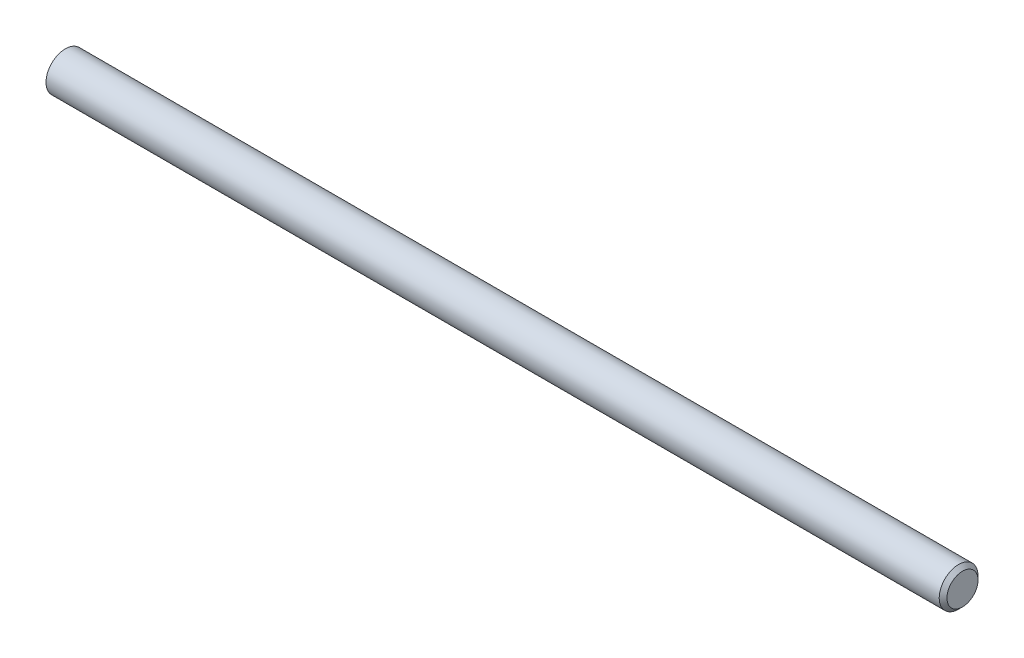
ISO-10303-21;
HEADER;
FILE_DESCRIPTION(('STEP AP214'),'2;1');
FILE_NAME('part.step','',(''),(''),'','','');
FILE_SCHEMA(('AUTOMOTIVE_DESIGN { 1 0 10303 214 1 1 1 1 }'));
ENDSEC;
DATA;
#1=APPLICATION_CONTEXT('core data for automotive mechanical design processes');
#2=APPLICATION_PROTOCOL_DEFINITION('international standard','automotive_design',2000,#1);
#3=PRODUCT_CONTEXT('',#1,'mechanical');
#4=PRODUCT('Part','Part','',(#3));
#5=PRODUCT_RELATED_PRODUCT_CATEGORY('part','',(#4));
#6=PRODUCT_DEFINITION_FORMATION('','',#4);
#7=PRODUCT_DEFINITION_CONTEXT('part definition',#1,'design');
#8=PRODUCT_DEFINITION('design','',#6,#7);
#9=PRODUCT_DEFINITION_SHAPE('','',#8);
#10=(LENGTH_UNIT() NAMED_UNIT(*) SI_UNIT(.MILLI.,.METRE.));
#11=(NAMED_UNIT(*) PLANE_ANGLE_UNIT() SI_UNIT($,.RADIAN.));
#12=(NAMED_UNIT(*) SI_UNIT($,.STERADIAN.) SOLID_ANGLE_UNIT());
#13=UNCERTAINTY_MEASURE_WITH_UNIT(LENGTH_MEASURE(1.E-05),#10,'distance_accuracy_value','');
#14=(GEOMETRIC_REPRESENTATION_CONTEXT(3) GLOBAL_UNCERTAINTY_ASSIGNED_CONTEXT((#13)) GLOBAL_UNIT_ASSIGNED_CONTEXT((#10,
#11,#12)) REPRESENTATION_CONTEXT('',''));
#15=CARTESIAN_POINT('',(0.,0.,0.));
#16=DIRECTION('',(0.,0.,1.));
#17=DIRECTION('',(1.,0.,0.));
#18=AXIS2_PLACEMENT_3D('',#15,#16,#17);
#19=CARTESIAN_POINT('',(0.,0.,-4.));
#20=DIRECTION('',(1.,0.,0.));
#21=DIRECTION('',(0.,0.,-1.));
#22=AXIS2_PLACEMENT_3D('',#19,#20,#21);
#23=PLANE('',#22);
#24=CARTESIAN_POINT('',(0.,0.,0.));
#25=DIRECTION('',(-1.,0.,0.));
#26=DIRECTION('',(0.,0.,1.));
#27=AXIS2_PLACEMENT_3D('',#24,#25,#26);
#28=CIRCLE('',#27,4.);
#29=CARTESIAN_POINT('',(0.,0.,4.));
#30=VERTEX_POINT('',#29);
#31=EDGE_CURVE('E45',#30,#30,#28,.T.);
#32=ORIENTED_EDGE('',*,*,#31,.T.);
#33=EDGE_LOOP('',(#32));
#34=FACE_BOUND('',#33,.T.);
#35=ADVANCED_FACE('F35',(#34),#23,.F.);
#36=CARTESIAN_POINT('',(185.,0.,0.));
#37=DIRECTION('',(-1.,0.,0.));
#38=DIRECTION('',(0.,0.,1.));
#39=AXIS2_PLACEMENT_3D('',#36,#37,#38);
#40=PLANE('',#39);
#41=CARTESIAN_POINT('',(185.,0.,0.));
#42=DIRECTION('',(-1.,0.,0.));
#43=DIRECTION('',(0.,0.,1.));
#44=AXIS2_PLACEMENT_3D('',#41,#42,#43);
#45=CIRCLE('',#44,3.2);
#46=CARTESIAN_POINT('',(185.,0.,3.2));
#47=VERTEX_POINT('',#46);
#48=EDGE_CURVE('E10',#47,#47,#45,.T.);
#49=ORIENTED_EDGE('',*,*,#48,.F.);
#50=EDGE_LOOP('',(#49));
#51=FACE_BOUND('',#50,.T.);
#52=ADVANCED_FACE('F60',(#51),#40,.F.);
#53=CARTESIAN_POINT('',(185.,0.,0.));
#54=DIRECTION('',(-1.,0.,0.));
#55=DIRECTION('',(0.,0.,1.));
#56=AXIS2_PLACEMENT_3D('',#53,#54,#55);
#57=CONICAL_SURFACE('',#56,3.2,0.785398163397465);
#58=CARTESIAN_POINT('',(184.2,0.,0.));
#59=DIRECTION('',(-1.,0.,0.));
#60=DIRECTION('',(0.,0.,1.));
#61=AXIS2_PLACEMENT_3D('',#58,#59,#60);
#62=CIRCLE('',#61,4.00000000000002);
#63=CARTESIAN_POINT('',(184.2,0.,4.00000000000002));
#64=VERTEX_POINT('',#63);
#65=EDGE_CURVE('E41',#64,#64,#62,.T.);
#66=ORIENTED_EDGE('',*,*,#65,.F.);
#67=EDGE_LOOP('',(#66));
#68=FACE_BOUND('',#67,.T.);
#69=ORIENTED_EDGE('',*,*,#48,.T.);
#70=EDGE_LOOP('',(#69));
#71=FACE_BOUND('',#70,.T.);
#72=ADVANCED_FACE('F55',(#68,#71),#57,.T.);
#73=CARTESIAN_POINT('',(0.,0.,0.));
#74=DIRECTION('',(-1.,0.,0.));
#75=DIRECTION('',(0.,0.,1.));
#76=AXIS2_PLACEMENT_3D('',#73,#74,#75);
#77=CYLINDRICAL_SURFACE('',#76,4.00000000000001);
#78=ORIENTED_EDGE('',*,*,#31,.F.);
#79=EDGE_LOOP('',(#78));
#80=FACE_BOUND('',#79,.T.);
#81=ORIENTED_EDGE('',*,*,#65,.T.);
#82=EDGE_LOOP('',(#81));
#83=FACE_BOUND('',#82,.T.);
#84=ADVANCED_FACE('F53',(#80,#83),#77,.T.);
#85=CLOSED_SHELL('',(#35,#52,#72,#84));
#86=MANIFOLD_SOLID_BREP('B2',#85);
#87=ADVANCED_BREP_SHAPE_REPRESENTATION('',(#18,#86),#14);
#88=SHAPE_DEFINITION_REPRESENTATION(#9,#87);
ENDSEC;
END-ISO-10303-21;
